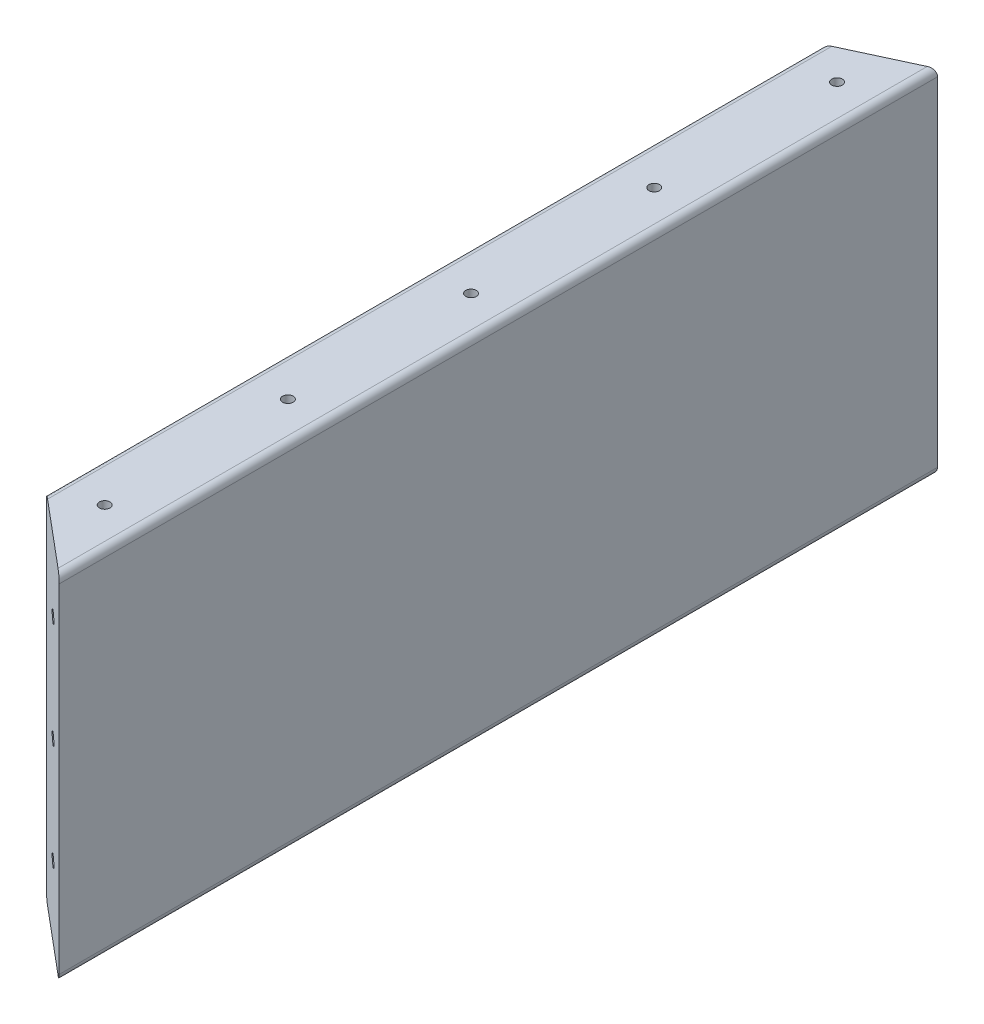
ISO-10303-21;
HEADER;
FILE_DESCRIPTION(('STEP AP214'),'2;1');
FILE_NAME('part.step','',(''),(''),'','','');
FILE_SCHEMA(('AUTOMOTIVE_DESIGN { 1 0 10303 214 1 1 1 1 }'));
ENDSEC;
DATA;
#1=APPLICATION_CONTEXT('core data for automotive mechanical design processes');
#2=APPLICATION_PROTOCOL_DEFINITION('international standard','automotive_design',2000,#1);
#3=PRODUCT_CONTEXT('',#1,'mechanical');
#4=PRODUCT('Part','Part','',(#3));
#5=PRODUCT_RELATED_PRODUCT_CATEGORY('part','',(#4));
#6=PRODUCT_DEFINITION_FORMATION('','',#4);
#7=PRODUCT_DEFINITION_CONTEXT('part definition',#1,'design');
#8=PRODUCT_DEFINITION('design','',#6,#7);
#9=PRODUCT_DEFINITION_SHAPE('','',#8);
#10=(LENGTH_UNIT() NAMED_UNIT(*) SI_UNIT(.MILLI.,.METRE.));
#11=(NAMED_UNIT(*) PLANE_ANGLE_UNIT() SI_UNIT($,.RADIAN.));
#12=(NAMED_UNIT(*) SI_UNIT($,.STERADIAN.) SOLID_ANGLE_UNIT());
#13=UNCERTAINTY_MEASURE_WITH_UNIT(LENGTH_MEASURE(1.E-05),#10,'distance_accuracy_value','');
#14=(GEOMETRIC_REPRESENTATION_CONTEXT(3) GLOBAL_UNCERTAINTY_ASSIGNED_CONTEXT((#13)) GLOBAL_UNIT_ASSIGNED_CONTEXT((#10,
#11,#12)) REPRESENTATION_CONTEXT('',''));
#15=CARTESIAN_POINT('',(0.,0.,0.));
#16=DIRECTION('',(0.,0.,1.));
#17=DIRECTION('',(1.,0.,0.));
#18=AXIS2_PLACEMENT_3D('',#15,#16,#17);
#19=CARTESIAN_POINT('',(-31.1882554112285,134.272684877163,510.));
#20=DIRECTION('',(0.,-1.,0.));
#21=DIRECTION('',(0.,0.,-1.));
#22=AXIS2_PLACEMENT_3D('',#19,#20,#21);
#23=PLANE('',#22);
#24=CARTESIAN_POINT('',(-8.08623886319948,134.272684877163,450.93561149229));
#25=DIRECTION('',(0.,-1.,0.));
#26=DIRECTION('',(0.,0.,-1.));
#27=AXIS2_PLACEMENT_3D('',#24,#25,#26);
#28=CIRCLE('',#27,2.99999999999999);
#29=CARTESIAN_POINT('',(-8.08623886319948,134.272684877163,447.93561149229));
#30=VERTEX_POINT('',#29);
#31=EDGE_CURVE('E175',#30,#30,#28,.T.);
#32=ORIENTED_EDGE('',*,*,#31,.T.);
#33=EDGE_LOOP('',(#32));
#34=FACE_BOUND('',#33,.T.);
#35=CARTESIAN_POINT('',(-8.11900232171636,134.272684877163,35.1370040691587));
#36=DIRECTION('',(0.,-1.,0.));
#37=DIRECTION('',(0.,0.,-1.));
#38=AXIS2_PLACEMENT_3D('',#35,#36,#37);
#39=CIRCLE('',#38,2.99999999999999);
#40=CARTESIAN_POINT('',(-8.11900232171636,134.272684877163,32.1370040691587));
#41=VERTEX_POINT('',#40);
#42=EDGE_CURVE('E179',#41,#41,#39,.T.);
#43=ORIENTED_EDGE('',*,*,#42,.T.);
#44=EDGE_LOOP('',(#43));
#45=FACE_BOUND('',#44,.T.);
#46=CARTESIAN_POINT('',(-8.0944336950588,134.272684877163,346.935611815152));
#47=DIRECTION('',(0.,-1.,0.));
#48=DIRECTION('',(0.,0.,-1.));
#49=AXIS2_PLACEMENT_3D('',#46,#47,#48);
#50=CIRCLE('',#49,2.99999999999999);
#51=CARTESIAN_POINT('',(-8.0944336950588,134.272684877163,343.935611815152));
#52=VERTEX_POINT('',#51);
#53=EDGE_CURVE('E183',#52,#52,#50,.T.);
#54=ORIENTED_EDGE('',*,*,#53,.T.);
#55=EDGE_LOOP('',(#54));
#56=FACE_BOUND('',#55,.T.);
#57=CARTESIAN_POINT('',(-8.10262852691812,134.272684877163,242.935612138014));
#58=DIRECTION('',(0.,-1.,0.));
#59=DIRECTION('',(0.,0.,-1.));
#60=AXIS2_PLACEMENT_3D('',#57,#58,#59);
#61=CIRCLE('',#60,2.99999999999999);
#62=CARTESIAN_POINT('',(-8.10262852691812,134.272684877163,239.935612138014));
#63=VERTEX_POINT('',#62);
#64=EDGE_CURVE('E187',#63,#63,#61,.T.);
#65=ORIENTED_EDGE('',*,*,#64,.T.);
#66=EDGE_LOOP('',(#65));
#67=FACE_BOUND('',#66,.T.);
#68=CARTESIAN_POINT('',(-8.11082335877744,134.272684877163,138.935612460876));
#69=DIRECTION('',(0.,-1.,0.));
#70=DIRECTION('',(0.,0.,-1.));
#71=AXIS2_PLACEMENT_3D('',#68,#69,#70);
#72=CIRCLE('',#71,2.99999999999999);
#73=CARTESIAN_POINT('',(-8.11082335877744,134.272684877163,135.935612460876));
#74=VERTEX_POINT('',#73);
#75=EDGE_CURVE('E191',#74,#74,#72,.T.);
#76=ORIENTED_EDGE('',*,*,#75,.T.);
#77=EDGE_LOOP('',(#76));
#78=FACE_BOUND('',#77,.T.);
#79=DIRECTION('',(0.907126965711573,0.,-0.420857063715122));
#80=VECTOR('',#79,1.);
#81=CARTESIAN_POINT('',(-217.92092886283,134.272684877163,107.511226324524));
#82=LINE('',#81,#80);
#83=CARTESIAN_POINT('',(-27.1882554112285,134.272684877163,19.0217469709818));
#84=VERTEX_POINT('',#83);
#85=CARTESIAN_POINT('',(9.81174458877147,134.272684877163,1.85578019229093));
#86=VERTEX_POINT('',#85);
#87=EDGE_CURVE('E49',#84,#86,#82,.T.);
#88=ORIENTED_EDGE('',*,*,#87,.F.);
#89=DIRECTION('',(0.,0.,-1.));
#90=VECTOR('',#89,1.);
#91=CARTESIAN_POINT('',(-27.1882554112285,134.272684877163,510.));
#92=LINE('',#91,#90);
#93=CARTESIAN_POINT('',(-27.1882554112285,134.272684877163,464.274109805575));
#94=VERTEX_POINT('',#93);
#95=EDGE_CURVE('E41',#84,#94,#92,.F.);
#96=ORIENTED_EDGE('',*,*,#95,.T.);
#97=DIRECTION('',(-0.766068203582476,0.,-0.642759292005894));
#98=VECTOR('',#97,1.);
#99=CARTESIAN_POINT('',(-7.02038536886983,134.272684877163,481.195691734014));
#100=LINE('',#99,#98);
#101=CARTESIAN_POINT('',(9.81174458877147,134.272684877163,495.318465507851));
#102=VERTEX_POINT('',#101);
#103=EDGE_CURVE('E251',#102,#94,#100,.T.);
#104=ORIENTED_EDGE('',*,*,#103,.F.);
#105=DIRECTION('',(0.,0.,-1.));
#106=VECTOR('',#105,1.);
#107=CARTESIAN_POINT('',(9.81174458877147,134.272684877163,510.));
#108=LINE('',#107,#106);
#109=EDGE_CURVE('E286',#102,#86,#108,.T.);
#110=ORIENTED_EDGE('',*,*,#109,.T.);
#111=EDGE_LOOP('',(#88,#96,#104,#110));
#112=FACE_BOUND('',#111,.T.);
#113=ADVANCED_FACE('F32',(#34,#45,#56,#67,#78,#112),#23,.F.);
#114=CARTESIAN_POINT('',(-31.1882554112285,-65.7273151228369,510.));
#115=DIRECTION('',(0.,1.,0.));
#116=DIRECTION('',(0.,0.,1.));
#117=AXIS2_PLACEMENT_3D('',#114,#115,#116);
#118=PLANE('',#117);
#119=CARTESIAN_POINT('',(-8.08623886319952,-65.7273151228369,450.93561149229));
#120=DIRECTION('',(0.,1.,0.));
#121=DIRECTION('',(0.,0.,1.));
#122=AXIS2_PLACEMENT_3D('',#119,#120,#121);
#123=CIRCLE('',#122,2.99999999999999);
#124=CARTESIAN_POINT('',(-8.08623886319952,-65.7273151228369,453.93561149229));
#125=VERTEX_POINT('',#124);
#126=EDGE_CURVE('E36',#125,#125,#123,.T.);
#127=ORIENTED_EDGE('',*,*,#126,.T.);
#128=EDGE_LOOP('',(#127));
#129=FACE_BOUND('',#128,.T.);
#130=CARTESIAN_POINT('',(-8.1190023217164,-65.7273151228369,35.1370040691587));
#131=DIRECTION('',(0.,1.,0.));
#132=DIRECTION('',(0.,0.,1.));
#133=AXIS2_PLACEMENT_3D('',#130,#131,#132);
#134=CIRCLE('',#133,2.99999999999999);
#135=CARTESIAN_POINT('',(-8.1190023217164,-65.7273151228369,38.1370040691587));
#136=VERTEX_POINT('',#135);
#137=EDGE_CURVE('E159',#136,#136,#134,.T.);
#138=ORIENTED_EDGE('',*,*,#137,.T.);
#139=EDGE_LOOP('',(#138));
#140=FACE_BOUND('',#139,.T.);
#141=CARTESIAN_POINT('',(-8.09443369505884,-65.7273151228369,346.935611815152));
#142=DIRECTION('',(0.,1.,0.));
#143=DIRECTION('',(0.,0.,1.));
#144=AXIS2_PLACEMENT_3D('',#141,#142,#143);
#145=CIRCLE('',#144,2.99999999999999);
#146=CARTESIAN_POINT('',(-8.09443369505884,-65.7273151228369,349.935611815152));
#147=VERTEX_POINT('',#146);
#148=EDGE_CURVE('E163',#147,#147,#145,.T.);
#149=ORIENTED_EDGE('',*,*,#148,.T.);
#150=EDGE_LOOP('',(#149));
#151=FACE_BOUND('',#150,.T.);
#152=CARTESIAN_POINT('',(-8.10262852691816,-65.7273151228369,242.935612138014));
#153=DIRECTION('',(0.,1.,0.));
#154=DIRECTION('',(0.,0.,1.));
#155=AXIS2_PLACEMENT_3D('',#152,#153,#154);
#156=CIRCLE('',#155,2.99999999999999);
#157=CARTESIAN_POINT('',(-8.10262852691816,-65.7273151228369,245.935612138014));
#158=VERTEX_POINT('',#157);
#159=EDGE_CURVE('E167',#158,#158,#156,.T.);
#160=ORIENTED_EDGE('',*,*,#159,.T.);
#161=EDGE_LOOP('',(#160));
#162=FACE_BOUND('',#161,.T.);
#163=CARTESIAN_POINT('',(-8.11082335877748,-65.7273151228369,138.935612460876));
#164=DIRECTION('',(0.,1.,0.));
#165=DIRECTION('',(0.,0.,1.));
#166=AXIS2_PLACEMENT_3D('',#163,#164,#165);
#167=CIRCLE('',#166,2.99999999999999);
#168=CARTESIAN_POINT('',(-8.11082335877748,-65.7273151228369,141.935612460876));
#169=VERTEX_POINT('',#168);
#170=EDGE_CURVE('E171',#169,#169,#167,.T.);
#171=ORIENTED_EDGE('',*,*,#170,.T.);
#172=EDGE_LOOP('',(#171));
#173=FACE_BOUND('',#172,.T.);
#174=DIRECTION('',(-0.907126965711573,0.,0.420857063715122));
#175=VECTOR('',#174,1.);
#176=CARTESIAN_POINT('',(-217.92092886283,-65.7273151228369,107.511226324524));
#177=LINE('',#176,#175);
#178=CARTESIAN_POINT('',(9.81174458877147,-65.7273151228369,1.85578019229093));
#179=VERTEX_POINT('',#178);
#180=CARTESIAN_POINT('',(-27.1882554112285,-65.7273151228369,19.0217469709818));
#181=VERTEX_POINT('',#180);
#182=EDGE_CURVE('E243',#179,#181,#177,.T.);
#183=ORIENTED_EDGE('',*,*,#182,.F.);
#184=DIRECTION('',(0.,0.,-1.));
#185=VECTOR('',#184,1.);
#186=CARTESIAN_POINT('',(9.81174458877147,-65.7273151228369,510.));
#187=LINE('',#186,#185);
#188=CARTESIAN_POINT('',(9.81174458877147,-65.7273151228369,495.318465507851));
#189=VERTEX_POINT('',#188);
#190=EDGE_CURVE('E270',#179,#189,#187,.F.);
#191=ORIENTED_EDGE('',*,*,#190,.T.);
#192=DIRECTION('',(0.766068203582476,0.,0.642759292005894));
#193=VECTOR('',#192,1.);
#194=CARTESIAN_POINT('',(-7.02038536886982,-65.7273151228369,481.195691734014));
#195=LINE('',#194,#193);
#196=CARTESIAN_POINT('',(-27.1882554112285,-65.7273151228369,464.274109805575));
#197=VERTEX_POINT('',#196);
#198=EDGE_CURVE('E261',#197,#189,#195,.T.);
#199=ORIENTED_EDGE('',*,*,#198,.F.);
#200=DIRECTION('',(0.,0.,-1.));
#201=VECTOR('',#200,1.);
#202=CARTESIAN_POINT('',(-27.1882554112285,-65.7273151228369,510.));
#203=LINE('',#202,#201);
#204=EDGE_CURVE('E272',#197,#181,#203,.T.);
#205=ORIENTED_EDGE('',*,*,#204,.T.);
#206=EDGE_LOOP('',(#183,#191,#199,#205));
#207=FACE_BOUND('',#206,.T.);
#208=ADVANCED_FACE('F314',(#129,#140,#151,#162,#173,#207),#118,.F.);
#209=CARTESIAN_POINT('',(-27.1882554112285,-61.7273151228369,510.));
#210=DIRECTION('',(0.,0.,-1.));
#211=DIRECTION('',(-1.,0.,0.));
#212=AXIS2_PLACEMENT_3D('',#209,#210,#211);
#213=CYLINDRICAL_SURFACE('',#212,4.);
#214=DIRECTION('',(0.,0.,-1.));
#215=VECTOR('',#214,1.);
#216=CARTESIAN_POINT('',(-31.1882554112285,-61.7273151228369,510.));
#217=LINE('',#216,#215);
#218=CARTESIAN_POINT('',(-31.1882554112285,-61.7273151228369,20.8775271632726));
#219=VERTEX_POINT('',#218);
#220=CARTESIAN_POINT('',(-31.1882554112285,-61.7273151228369,460.917963243167));
#221=VERTEX_POINT('',#220);
#222=EDGE_CURVE('E278',#219,#221,#217,.F.);
#223=ORIENTED_EDGE('',*,*,#222,.F.);
#224=CARTESIAN_POINT('',(-27.1882554112285,-61.7273151228369,19.0217469709817));
#225=DIRECTION('',(-0.420857063715122,0.,-0.907126965711573));
#226=DIRECTION('',(0.907126965711573,0.,-0.420857063715122));
#227=AXIS2_PLACEMENT_3D('',#224,#225,#226);
#228=ELLIPSE('',#227,4.40952606547453,4.);
#229=EDGE_CURVE('E245',#219,#181,#228,.F.);
#230=ORIENTED_EDGE('',*,*,#229,.T.);
#231=ORIENTED_EDGE('',*,*,#204,.F.);
#232=CARTESIAN_POINT('',(-27.1882554112285,-61.7273151228369,464.274109805575));
#233=DIRECTION('',(-0.642759292005894,0.,0.766068203582476));
#234=DIRECTION('',(-0.766068203582476,0.,-0.642759292005894));
#235=AXIS2_PLACEMENT_3D('',#232,#233,#234);
#236=ELLIPSE('',#235,5.22146720265143,4.);
#237=EDGE_CURVE('E264',#197,#221,#236,.F.);
#238=ORIENTED_EDGE('',*,*,#237,.T.);
#239=EDGE_LOOP('',(#223,#230,#231,#238));
#240=FACE_BOUND('',#239,.T.);
#241=ADVANCED_FACE('F340',(#240),#213,.T.);
#242=CARTESIAN_POINT('',(9.81174458877148,-61.7273151228369,510.));
#243=DIRECTION('',(0.,0.,-1.));
#244=DIRECTION('',(-1.,0.,0.));
#245=AXIS2_PLACEMENT_3D('',#242,#243,#244);
#246=CYLINDRICAL_SURFACE('',#245,4.);
#247=ORIENTED_EDGE('',*,*,#190,.F.);
#248=CARTESIAN_POINT('',(9.81174458877148,-61.7273151228369,1.85578019229093));
#249=DIRECTION('',(-0.420857063715122,0.,-0.907126965711573));
#250=DIRECTION('',(0.907126965711573,0.,-0.420857063715122));
#251=AXIS2_PLACEMENT_3D('',#248,#249,#250);
#252=ELLIPSE('',#251,4.40952606547453,4.);
#253=CARTESIAN_POINT('',(13.8117445887715,-61.7273151228369,0.));
#254=VERTEX_POINT('',#253);
#255=EDGE_CURVE('E240',#179,#254,#252,.F.);
#256=ORIENTED_EDGE('',*,*,#255,.T.);
#257=DIRECTION('',(0.,0.,-1.));
#258=VECTOR('',#257,1.);
#259=CARTESIAN_POINT('',(13.8117445887715,-61.7273151228369,510.));
#260=LINE('',#259,#258);
#261=CARTESIAN_POINT('',(13.8117445887715,-61.7273151228369,498.674612070259));
#262=VERTEX_POINT('',#261);
#263=EDGE_CURVE('E283',#262,#254,#260,.T.);
#264=ORIENTED_EDGE('',*,*,#263,.F.);
#265=CARTESIAN_POINT('',(9.81174458877148,-61.7273151228369,495.318465507851));
#266=DIRECTION('',(-0.642759292005894,0.,0.766068203582476));
#267=DIRECTION('',(-0.766068203582476,0.,-0.642759292005894));
#268=AXIS2_PLACEMENT_3D('',#265,#266,#267);
#269=ELLIPSE('',#268,5.22146720265143,4.);
#270=EDGE_CURVE('E258',#262,#189,#269,.F.);
#271=ORIENTED_EDGE('',*,*,#270,.T.);
#272=EDGE_LOOP('',(#247,#256,#264,#271));
#273=FACE_BOUND('',#272,.T.);
#274=ADVANCED_FACE('F349',(#273),#246,.T.);
#275=CARTESIAN_POINT('',(-27.1882554112285,130.272684877163,510.));
#276=DIRECTION('',(0.,0.,-1.));
#277=DIRECTION('',(-1.,0.,0.));
#278=AXIS2_PLACEMENT_3D('',#275,#276,#277);
#279=CYLINDRICAL_SURFACE('',#278,4.);
#280=ORIENTED_EDGE('',*,*,#95,.F.);
#281=CARTESIAN_POINT('',(-27.1882554112285,130.272684877163,19.0217469709817));
#282=DIRECTION('',(-0.420857063715122,0.,-0.907126965711573));
#283=DIRECTION('',(0.907126965711573,0.,-0.420857063715122));
#284=AXIS2_PLACEMENT_3D('',#281,#282,#283);
#285=ELLIPSE('',#284,4.40952606547453,4.);
#286=CARTESIAN_POINT('',(-31.1882554112285,130.272684877163,20.8775271632726));
#287=VERTEX_POINT('',#286);
#288=EDGE_CURVE('E237',#84,#287,#285,.F.);
#289=ORIENTED_EDGE('',*,*,#288,.T.);
#290=DIRECTION('',(0.,0.,-1.));
#291=VECTOR('',#290,1.);
#292=CARTESIAN_POINT('',(-31.1882554112285,130.272684877163,510.));
#293=LINE('',#292,#291);
#294=CARTESIAN_POINT('',(-31.1882554112285,130.272684877163,460.917963243167));
#295=VERTEX_POINT('',#294);
#296=EDGE_CURVE('E275',#295,#287,#293,.T.);
#297=ORIENTED_EDGE('',*,*,#296,.F.);
#298=CARTESIAN_POINT('',(-27.1882554112285,130.272684877163,464.274109805575));
#299=DIRECTION('',(-0.642759292005894,0.,0.766068203582476));
#300=DIRECTION('',(-0.766068203582476,0.,-0.642759292005894));
#301=AXIS2_PLACEMENT_3D('',#298,#299,#300);
#302=ELLIPSE('',#301,5.22146720265143,4.);
#303=EDGE_CURVE('E255',#295,#94,#302,.F.);
#304=ORIENTED_EDGE('',*,*,#303,.T.);
#305=EDGE_LOOP('',(#280,#289,#297,#304));
#306=FACE_BOUND('',#305,.T.);
#307=ADVANCED_FACE('F352',(#306),#279,.T.);
#308=CARTESIAN_POINT('',(9.81174458877147,130.272684877163,510.));
#309=DIRECTION('',(0.,0.,-1.));
#310=DIRECTION('',(-1.,0.,0.));
#311=AXIS2_PLACEMENT_3D('',#308,#309,#310);
#312=CYLINDRICAL_SURFACE('',#311,4.);
#313=DIRECTION('',(0.,0.,-1.));
#314=VECTOR('',#313,1.);
#315=CARTESIAN_POINT('',(13.8117445887715,130.272684877163,510.));
#316=LINE('',#315,#314);
#317=CARTESIAN_POINT('',(13.8117445887715,130.272684877163,0.));
#318=VERTEX_POINT('',#317);
#319=CARTESIAN_POINT('',(13.8117445887715,130.272684877163,498.674612070259));
#320=VERTEX_POINT('',#319);
#321=EDGE_CURVE('E280',#318,#320,#316,.F.);
#322=ORIENTED_EDGE('',*,*,#321,.F.);
#323=CARTESIAN_POINT('',(9.81174458877147,130.272684877163,1.85578019229093));
#324=DIRECTION('',(-0.420857063715122,0.,-0.907126965711573));
#325=DIRECTION('',(0.907126965711573,0.,-0.420857063715122));
#326=AXIS2_PLACEMENT_3D('',#323,#324,#325);
#327=ELLIPSE('',#326,4.40952606547453,4.);
#328=EDGE_CURVE('E234',#318,#86,#327,.F.);
#329=ORIENTED_EDGE('',*,*,#328,.T.);
#330=ORIENTED_EDGE('',*,*,#109,.F.);
#331=CARTESIAN_POINT('',(9.81174458877147,130.272684877163,495.318465507851));
#332=DIRECTION('',(-0.642759292005894,0.,0.766068203582476));
#333=DIRECTION('',(-0.766068203582476,0.,-0.642759292005894));
#334=AXIS2_PLACEMENT_3D('',#331,#332,#333);
#335=ELLIPSE('',#334,5.22146720265143,4.);
#336=EDGE_CURVE('E11',#102,#320,#335,.F.);
#337=ORIENTED_EDGE('',*,*,#336,.T.);
#338=EDGE_LOOP('',(#322,#329,#330,#337));
#339=FACE_BOUND('',#338,.T.);
#340=ADVANCED_FACE('F34',(#339),#312,.T.);
#341=CARTESIAN_POINT('',(-31.1882554112285,134.272684877163,510.));
#342=DIRECTION('',(1.,0.,0.));
#343=DIRECTION('',(0.,1.,0.));
#344=AXIS2_PLACEMENT_3D('',#341,#342,#343);
#345=PLANE('',#344);
#346=ORIENTED_EDGE('',*,*,#296,.T.);
#347=DIRECTION('',(0.,-1.,0.));
#348=VECTOR('',#347,1.);
#349=CARTESIAN_POINT('',(-31.1882554112285,813.231799831734,20.8775271632727));
#350=LINE('',#349,#348);
#351=EDGE_CURVE('E231',#287,#219,#350,.T.);
#352=ORIENTED_EDGE('',*,*,#351,.T.);
#353=ORIENTED_EDGE('',*,*,#222,.T.);
#354=DIRECTION('',(0.,-1.,0.));
#355=VECTOR('',#354,1.);
#356=CARTESIAN_POINT('',(-31.1882554112285,821.346416364549,460.917963243167));
#357=LINE('',#356,#355);
#358=EDGE_CURVE('E248',#295,#221,#357,.T.);
#359=ORIENTED_EDGE('',*,*,#358,.F.);
#360=EDGE_LOOP('',(#346,#352,#353,#359));
#361=FACE_BOUND('',#360,.T.);
#362=ADVANCED_FACE('F346',(#361),#345,.F.);
#363=CARTESIAN_POINT('',(13.8117445887715,134.272684877163,510.));
#364=DIRECTION('',(-1.,0.,0.));
#365=DIRECTION('',(0.,0.,1.));
#366=AXIS2_PLACEMENT_3D('',#363,#364,#365);
#367=PLANE('',#366);
#368=ORIENTED_EDGE('',*,*,#321,.T.);
#369=DIRECTION('',(0.,-1.,0.));
#370=VECTOR('',#369,1.);
#371=CARTESIAN_POINT('',(13.8117445887715,821.346416364549,498.674612070259));
#372=LINE('',#371,#370);
#373=EDGE_CURVE('E57',#320,#262,#372,.T.);
#374=ORIENTED_EDGE('',*,*,#373,.T.);
#375=ORIENTED_EDGE('',*,*,#263,.T.);
#376=DIRECTION('',(0.,1.,0.));
#377=VECTOR('',#376,1.);
#378=CARTESIAN_POINT('',(13.8117445887715,134.272684877163,0.));
#379=LINE('',#378,#377);
#380=EDGE_CURVE('E267',#254,#318,#379,.T.);
#381=ORIENTED_EDGE('',*,*,#380,.T.);
#382=EDGE_LOOP('',(#368,#374,#375,#381));
#383=FACE_BOUND('',#382,.T.);
#384=ADVANCED_FACE('F369',(#383),#367,.F.);
#385=CARTESIAN_POINT('',(13.8117445887715,821.346416364549,498.674612070259));
#386=DIRECTION('',(-0.642759292005894,0.,0.766068203582476));
#387=DIRECTION('',(0.766068203582476,0.,0.642759292005894));
#388=AXIS2_PLACEMENT_3D('',#385,#386,#387);
#389=PLANE('',#388);
#390=CARTESIAN_POINT('',(-7.918215451858,94.2726848771541,480.442379397352));
#391=DIRECTION('',(-0.642759292005894,0.,0.766068203582476));
#392=DIRECTION('',(0.766068203582476,0.,0.642759292005894));
#393=AXIS2_PLACEMENT_3D('',#390,#391,#392);
#394=ELLIPSE('',#393,3.91610040198854,2.99999999999998);
#395=CARTESIAN_POINT('',(-4.91821545185802,94.2726848771541,482.959489319159));
#396=VERTEX_POINT('',#395);
#397=EDGE_CURVE('E195',#396,#396,#394,.T.);
#398=ORIENTED_EDGE('',*,*,#397,.F.);
#399=EDGE_LOOP('',(#398));
#400=FACE_BOUND('',#399,.T.);
#401=CARTESIAN_POINT('',(-7.918215451858,34.2726848771547,480.442379397352));
#402=DIRECTION('',(-0.642759292005894,0.,0.766068203582476));
#403=DIRECTION('',(0.766068203582476,0.,0.642759292005894));
#404=AXIS2_PLACEMENT_3D('',#401,#402,#403);
#405=ELLIPSE('',#404,3.91610040198854,2.99999999999998);
#406=CARTESIAN_POINT('',(-4.91821545185802,34.2726848771547,482.959489319159));
#407=VERTEX_POINT('',#406);
#408=EDGE_CURVE('E199',#407,#407,#405,.T.);
#409=ORIENTED_EDGE('',*,*,#408,.F.);
#410=EDGE_LOOP('',(#409));
#411=FACE_BOUND('',#410,.T.);
#412=CARTESIAN_POINT('',(-7.918215451858,-25.7273151228453,480.442379397352));
#413=DIRECTION('',(-0.642759292005894,0.,0.766068203582476));
#414=DIRECTION('',(0.766068203582476,0.,0.642759292005894));
#415=AXIS2_PLACEMENT_3D('',#412,#413,#414);
#416=ELLIPSE('',#415,3.91610040198854,2.99999999999998);
#417=CARTESIAN_POINT('',(-4.91821545185802,-25.7273151228453,482.959489319159));
#418=VERTEX_POINT('',#417);
#419=EDGE_CURVE('E203',#418,#418,#416,.T.);
#420=ORIENTED_EDGE('',*,*,#419,.F.);
#421=EDGE_LOOP('',(#420));
#422=FACE_BOUND('',#421,.T.);
#423=ORIENTED_EDGE('',*,*,#237,.F.);
#424=ORIENTED_EDGE('',*,*,#198,.T.);
#425=ORIENTED_EDGE('',*,*,#270,.F.);
#426=ORIENTED_EDGE('',*,*,#373,.F.);
#427=ORIENTED_EDGE('',*,*,#336,.F.);
#428=ORIENTED_EDGE('',*,*,#103,.T.);
#429=ORIENTED_EDGE('',*,*,#303,.F.);
#430=ORIENTED_EDGE('',*,*,#358,.T.);
#431=EDGE_LOOP('',(#423,#424,#425,#426,#427,#428,#429,#430));
#432=FACE_BOUND('',#431,.T.);
#433=ADVANCED_FACE('F365',(#400,#411,#422,#432),#389,.T.);
#434=CARTESIAN_POINT('',(-31.1882554112285,813.231799831734,20.8775271632727));
#435=DIRECTION('',(-0.420857063715122,0.,-0.907126965711573));
#436=DIRECTION('',(-0.907126965711573,0.,0.420857063715122));
#437=AXIS2_PLACEMENT_3D('',#434,#435,#436);
#438=PLANE('',#437);
#439=CARTESIAN_POINT('',(-10.7778986827183,-25.7273151228369,11.4082432296824));
#440=DIRECTION('',(-0.420857063715122,0.,-0.907126965711573));
#441=DIRECTION('',(-0.907126965711573,0.,0.420857063715122));
#442=AXIS2_PLACEMENT_3D('',#439,#440,#441);
#443=CIRCLE('',#442,4.025);
#444=CARTESIAN_POINT('',(-14.4290847197074,-25.7273151228369,13.1021929111357));
#445=VERTEX_POINT('',#444);
#446=EDGE_CURVE('E204',#445,#445,#443,.T.);
#447=ORIENTED_EDGE('',*,*,#446,.F.);
#448=EDGE_LOOP('',(#447));
#449=FACE_BOUND('',#448,.T.);
#450=CARTESIAN_POINT('',(-10.7778986827183,34.2726848771631,11.4082432296824));
#451=DIRECTION('',(-0.420857063715122,0.,-0.907126965711573));
#452=DIRECTION('',(-0.907126965711573,0.,0.420857063715122));
#453=AXIS2_PLACEMENT_3D('',#450,#451,#452);
#454=CIRCLE('',#453,4.025);
#455=CARTESIAN_POINT('',(-14.4290847197074,34.2726848771631,13.1021929111357));
#456=VERTEX_POINT('',#455);
#457=EDGE_CURVE('E213',#456,#456,#454,.T.);
#458=ORIENTED_EDGE('',*,*,#457,.F.);
#459=EDGE_LOOP('',(#458));
#460=FACE_BOUND('',#459,.T.);
#461=CARTESIAN_POINT('',(-10.7778986827183,94.2726848771631,11.4082432296824));
#462=DIRECTION('',(-0.420857063715122,0.,-0.907126965711573));
#463=DIRECTION('',(-0.907126965711573,0.,0.420857063715122));
#464=AXIS2_PLACEMENT_3D('',#461,#462,#463);
#465=CIRCLE('',#464,4.025);
#466=CARTESIAN_POINT('',(-14.4290847197074,94.2726848771631,13.1021929111357));
#467=VERTEX_POINT('',#466);
#468=EDGE_CURVE('E222',#467,#467,#465,.T.);
#469=ORIENTED_EDGE('',*,*,#468,.F.);
#470=EDGE_LOOP('',(#469));
#471=FACE_BOUND('',#470,.T.);
#472=ORIENTED_EDGE('',*,*,#229,.F.);
#473=ORIENTED_EDGE('',*,*,#351,.F.);
#474=ORIENTED_EDGE('',*,*,#288,.F.);
#475=ORIENTED_EDGE('',*,*,#87,.T.);
#476=ORIENTED_EDGE('',*,*,#328,.F.);
#477=ORIENTED_EDGE('',*,*,#380,.F.);
#478=ORIENTED_EDGE('',*,*,#255,.F.);
#479=ORIENTED_EDGE('',*,*,#182,.T.);
#480=EDGE_LOOP('',(#472,#473,#474,#475,#476,#477,#478,#479));
#481=FACE_BOUND('',#480,.T.);
#482=ADVANCED_FACE('F371',(#449,#460,#471,#481),#438,.T.);
#483=CARTESIAN_POINT('',(-1.26797783314418,94.2726848771631,31.9061898918555));
#484=DIRECTION('',(-0.420857063715122,0.,-0.907126965711573));
#485=DIRECTION('',(-0.907126965711573,0.,0.420857063715122));
#486=AXIS2_PLACEMENT_3D('',#483,#484,#485);
#487=CONICAL_SURFACE('',#486,3.99999999999999,1.02974425867665);
#488=CARTESIAN_POINT('',(-0.256472089840226,94.2726848771631,34.0864173724717));
#489=VERTEX_POINT('',#488);
#490=VERTEX_LOOP('',#489);
#491=FACE_BOUND('',#490,.T.);
#492=CARTESIAN_POINT('',(-1.26797783314418,94.2726848771631,31.9061898918555));
#493=DIRECTION('',(-0.420857063715122,0.,-0.907126965711573));
#494=DIRECTION('',(-0.907126965711573,0.,0.420857063715122));
#495=AXIS2_PLACEMENT_3D('',#492,#493,#494);
#496=CIRCLE('',#495,3.99999999999999);
#497=CARTESIAN_POINT('',(-4.89648569599047,94.2726848771631,33.589618146716));
#498=VERTEX_POINT('',#497);
#499=EDGE_CURVE('E228',#498,#498,#496,.T.);
#500=ORIENTED_EDGE('',*,*,#499,.T.);
#501=EDGE_LOOP('',(#500));
#502=FACE_BOUND('',#501,.T.);
#503=ADVANCED_FACE('F392',(#491,#502),#487,.F.);
#504=CARTESIAN_POINT('',(-10.7778986827183,94.2726848771631,11.4082432296824));
#505=DIRECTION('',(-0.420857063715122,0.,-0.907126965711573));
#506=DIRECTION('',(-0.907126965711573,0.,0.420857063715122));
#507=AXIS2_PLACEMENT_3D('',#504,#505,#506);
#508=CYLINDRICAL_SURFACE('',#507,3.99999999999999);
#509=ORIENTED_EDGE('',*,*,#499,.F.);
#510=EDGE_LOOP('',(#509));
#511=FACE_BOUND('',#510,.T.);
#512=CARTESIAN_POINT('',(-10.7673772561254,94.2726848771631,11.4309214038252));
#513=DIRECTION('',(-0.420857063715122,0.,-0.907126965711573));
#514=DIRECTION('',(-0.907126965711573,0.,0.420857063715122));
#515=AXIS2_PLACEMENT_3D('',#512,#513,#514);
#516=CIRCLE('',#515,3.99999999999999);
#517=CARTESIAN_POINT('',(-14.3958851189717,94.2726848771631,13.1143496586857));
#518=VERTEX_POINT('',#517);
#519=EDGE_CURVE('E225',#518,#518,#516,.T.);
#520=ORIENTED_EDGE('',*,*,#519,.T.);
#521=EDGE_LOOP('',(#520));
#522=FACE_BOUND('',#521,.T.);
#523=ADVANCED_FACE('F396',(#511,#522),#508,.F.);
#524=CARTESIAN_POINT('',(-10.7778986827183,94.2726848771631,11.4082432296824));
#525=DIRECTION('',(-0.420857063715122,0.,-0.907126965711573));
#526=DIRECTION('',(-0.907126965711573,0.,0.420857063715122));
#527=AXIS2_PLACEMENT_3D('',#524,#525,#526);
#528=CONICAL_SURFACE('',#527,4.025,0.785398163397429);
#529=ORIENTED_EDGE('',*,*,#519,.F.);
#530=EDGE_LOOP('',(#529));
#531=FACE_BOUND('',#530,.T.);
#532=ORIENTED_EDGE('',*,*,#468,.T.);
#533=EDGE_LOOP('',(#532));
#534=FACE_BOUND('',#533,.T.);
#535=ADVANCED_FACE('F400',(#531,#534),#528,.F.);
#536=CARTESIAN_POINT('',(-1.26797783314418,34.2726848771631,31.9061898918555));
#537=DIRECTION('',(-0.420857063715122,0.,-0.907126965711573));
#538=DIRECTION('',(-0.907126965711573,0.,0.420857063715122));
#539=AXIS2_PLACEMENT_3D('',#536,#537,#538);
#540=CONICAL_SURFACE('',#539,4.,1.02974425867665);
#541=CARTESIAN_POINT('',(-0.256472089840226,34.2726848771631,34.0864173724717));
#542=VERTEX_POINT('',#541);
#543=VERTEX_LOOP('',#542);
#544=FACE_BOUND('',#543,.T.);
#545=CARTESIAN_POINT('',(-1.26797783314418,34.2726848771631,31.9061898918555));
#546=DIRECTION('',(-0.420857063715122,0.,-0.907126965711573));
#547=DIRECTION('',(-0.907126965711573,0.,0.420857063715122));
#548=AXIS2_PLACEMENT_3D('',#545,#546,#547);
#549=CIRCLE('',#548,4.);
#550=CARTESIAN_POINT('',(-4.89648569599047,34.2726848771631,33.589618146716));
#551=VERTEX_POINT('',#550);
#552=EDGE_CURVE('E219',#551,#551,#549,.T.);
#553=ORIENTED_EDGE('',*,*,#552,.T.);
#554=EDGE_LOOP('',(#553));
#555=FACE_BOUND('',#554,.T.);
#556=ADVANCED_FACE('F404',(#544,#555),#540,.F.);
#557=CARTESIAN_POINT('',(-10.7778986827183,34.2726848771631,11.4082432296824));
#558=DIRECTION('',(-0.420857063715122,0.,-0.907126965711573));
#559=DIRECTION('',(-0.907126965711573,0.,0.420857063715122));
#560=AXIS2_PLACEMENT_3D('',#557,#558,#559);
#561=CYLINDRICAL_SURFACE('',#560,3.99999999999999);
#562=ORIENTED_EDGE('',*,*,#552,.F.);
#563=EDGE_LOOP('',(#562));
#564=FACE_BOUND('',#563,.T.);
#565=CARTESIAN_POINT('',(-10.7673772561254,34.2726848771631,11.4309214038252));
#566=DIRECTION('',(-0.420857063715122,0.,-0.907126965711573));
#567=DIRECTION('',(-0.907126965711573,0.,0.420857063715122));
#568=AXIS2_PLACEMENT_3D('',#565,#566,#567);
#569=CIRCLE('',#568,3.99999999999999);
#570=CARTESIAN_POINT('',(-14.3958851189717,34.2726848771631,13.1143496586857));
#571=VERTEX_POINT('',#570);
#572=EDGE_CURVE('E216',#571,#571,#569,.T.);
#573=ORIENTED_EDGE('',*,*,#572,.T.);
#574=EDGE_LOOP('',(#573));
#575=FACE_BOUND('',#574,.T.);
#576=ADVANCED_FACE('F408',(#564,#575),#561,.F.);
#577=CARTESIAN_POINT('',(-10.7778986827183,34.2726848771631,11.4082432296824));
#578=DIRECTION('',(-0.420857063715122,0.,-0.907126965711573));
#579=DIRECTION('',(-0.907126965711573,0.,0.420857063715122));
#580=AXIS2_PLACEMENT_3D('',#577,#578,#579);
#581=CONICAL_SURFACE('',#580,4.025,0.785398163397429);
#582=ORIENTED_EDGE('',*,*,#572,.F.);
#583=EDGE_LOOP('',(#582));
#584=FACE_BOUND('',#583,.T.);
#585=ORIENTED_EDGE('',*,*,#457,.T.);
#586=EDGE_LOOP('',(#585));
#587=FACE_BOUND('',#586,.T.);
#588=ADVANCED_FACE('F412',(#584,#587),#581,.F.);
#589=CARTESIAN_POINT('',(-1.26797783314418,-25.7273151228369,31.9061898918555));
#590=DIRECTION('',(-0.420857063715122,0.,-0.907126965711573));
#591=DIRECTION('',(-0.907126965711573,0.,0.420857063715122));
#592=AXIS2_PLACEMENT_3D('',#589,#590,#591);
#593=CONICAL_SURFACE('',#592,3.99999999999999,1.02974425867665);
#594=CARTESIAN_POINT('',(-0.256472089840226,-25.7273151228369,34.0864173724717));
#595=VERTEX_POINT('',#594);
#596=VERTEX_LOOP('',#595);
#597=FACE_BOUND('',#596,.T.);
#598=CARTESIAN_POINT('',(-1.26797783314418,-25.7273151228369,31.9061898918555));
#599=DIRECTION('',(-0.420857063715122,0.,-0.907126965711573));
#600=DIRECTION('',(-0.907126965711573,0.,0.420857063715122));
#601=AXIS2_PLACEMENT_3D('',#598,#599,#600);
#602=CIRCLE('',#601,3.99999999999999);
#603=CARTESIAN_POINT('',(-4.89648569599047,-25.7273151228369,33.589618146716));
#604=VERTEX_POINT('',#603);
#605=EDGE_CURVE('E210',#604,#604,#602,.T.);
#606=ORIENTED_EDGE('',*,*,#605,.T.);
#607=EDGE_LOOP('',(#606));
#608=FACE_BOUND('',#607,.T.);
#609=ADVANCED_FACE('F416',(#597,#608),#593,.F.);
#610=CARTESIAN_POINT('',(-10.7778986827183,-25.7273151228369,11.4082432296824));
#611=DIRECTION('',(-0.420857063715122,0.,-0.907126965711573));
#612=DIRECTION('',(-0.907126965711573,0.,0.420857063715122));
#613=AXIS2_PLACEMENT_3D('',#610,#611,#612);
#614=CYLINDRICAL_SURFACE('',#613,3.99999999999999);
#615=ORIENTED_EDGE('',*,*,#605,.F.);
#616=EDGE_LOOP('',(#615));
#617=FACE_BOUND('',#616,.T.);
#618=CARTESIAN_POINT('',(-10.7673772561254,-25.7273151228369,11.4309214038252));
#619=DIRECTION('',(-0.420857063715122,0.,-0.907126965711573));
#620=DIRECTION('',(-0.907126965711573,0.,0.420857063715122));
#621=AXIS2_PLACEMENT_3D('',#618,#619,#620);
#622=CIRCLE('',#621,3.99999999999999);
#623=CARTESIAN_POINT('',(-14.3958851189717,-25.7273151228369,13.1143496586857));
#624=VERTEX_POINT('',#623);
#625=EDGE_CURVE('E207',#624,#624,#622,.T.);
#626=ORIENTED_EDGE('',*,*,#625,.T.);
#627=EDGE_LOOP('',(#626));
#628=FACE_BOUND('',#627,.T.);
#629=ADVANCED_FACE('F420',(#617,#628),#614,.F.);
#630=CARTESIAN_POINT('',(-10.7778986827183,-25.7273151228369,11.4082432296824));
#631=DIRECTION('',(-0.420857063715122,0.,-0.907126965711573));
#632=DIRECTION('',(-0.907126965711573,0.,0.420857063715122));
#633=AXIS2_PLACEMENT_3D('',#630,#631,#632);
#634=CONICAL_SURFACE('',#633,4.025,0.785398163397429);
#635=ORIENTED_EDGE('',*,*,#625,.F.);
#636=EDGE_LOOP('',(#635));
#637=FACE_BOUND('',#636,.T.);
#638=ORIENTED_EDGE('',*,*,#446,.T.);
#639=EDGE_LOOP('',(#638));
#640=FACE_BOUND('',#639,.T.);
#641=ADVANCED_FACE('F424',(#637,#640),#634,.F.);
#642=CARTESIAN_POINT('',(-7.918215451858,-25.7273151228453,438.26600215934));
#643=DIRECTION('',(0.,0.,1.));
#644=DIRECTION('',(1.,0.,0.));
#645=AXIS2_PLACEMENT_3D('',#642,#643,#644);
#646=CONICAL_SURFACE('',#645,2.99999999999997,1.02974425867664);
#647=CARTESIAN_POINT('',(-7.91821545185803,-25.7273151228453,436.463420302257));
#648=VERTEX_POINT('',#647);
#649=VERTEX_LOOP('',#648);
#650=FACE_BOUND('',#649,.T.);
#651=CARTESIAN_POINT('',(-7.918215451858,-25.7273151228453,438.26600215934));
#652=DIRECTION('',(0.,0.,1.));
#653=DIRECTION('',(1.,0.,0.));
#654=AXIS2_PLACEMENT_3D('',#651,#652,#653);
#655=CIRCLE('',#654,2.99999999999997);
#656=CARTESIAN_POINT('',(-4.91821545185803,-25.7273151228453,438.26600215934));
#657=VERTEX_POINT('',#656);
#658=EDGE_CURVE('E200',#657,#657,#655,.T.);
#659=ORIENTED_EDGE('',*,*,#658,.T.);
#660=EDGE_LOOP('',(#659));
#661=FACE_BOUND('',#660,.T.);
#662=ADVANCED_FACE('F428',(#650,#661),#646,.F.);
#663=CARTESIAN_POINT('',(-7.918215451858,-25.7273151228453,566.463420302257));
#664=DIRECTION('',(0.,0.,1.));
#665=DIRECTION('',(1.,0.,0.));
#666=AXIS2_PLACEMENT_3D('',#663,#664,#665);
#667=CYLINDRICAL_SURFACE('',#666,2.99999999999998);
#668=ORIENTED_EDGE('',*,*,#419,.T.);
#669=EDGE_LOOP('',(#668));
#670=FACE_BOUND('',#669,.T.);
#671=ORIENTED_EDGE('',*,*,#658,.F.);
#672=EDGE_LOOP('',(#671));
#673=FACE_BOUND('',#672,.T.);
#674=ADVANCED_FACE('F432',(#670,#673),#667,.F.);
#675=CARTESIAN_POINT('',(-7.918215451858,34.2726848771547,438.26600215934));
#676=DIRECTION('',(0.,0.,1.));
#677=DIRECTION('',(1.,0.,0.));
#678=AXIS2_PLACEMENT_3D('',#675,#676,#677);
#679=CONICAL_SURFACE('',#678,2.99999999999997,1.02974425867664);
#680=CARTESIAN_POINT('',(-7.91821545185803,34.2726848771547,436.463420302257));
#681=VERTEX_POINT('',#680);
#682=VERTEX_LOOP('',#681);
#683=FACE_BOUND('',#682,.T.);
#684=CARTESIAN_POINT('',(-7.918215451858,34.2726848771547,438.26600215934));
#685=DIRECTION('',(0.,0.,1.));
#686=DIRECTION('',(1.,0.,0.));
#687=AXIS2_PLACEMENT_3D('',#684,#685,#686);
#688=CIRCLE('',#687,2.99999999999997);
#689=CARTESIAN_POINT('',(-4.91821545185803,34.2726848771547,438.26600215934));
#690=VERTEX_POINT('',#689);
#691=EDGE_CURVE('E196',#690,#690,#688,.T.);
#692=ORIENTED_EDGE('',*,*,#691,.T.);
#693=EDGE_LOOP('',(#692));
#694=FACE_BOUND('',#693,.T.);
#695=ADVANCED_FACE('F436',(#683,#694),#679,.F.);
#696=CARTESIAN_POINT('',(-7.918215451858,34.2726848771547,566.463420302257));
#697=DIRECTION('',(0.,0.,1.));
#698=DIRECTION('',(1.,0.,0.));
#699=AXIS2_PLACEMENT_3D('',#696,#697,#698);
#700=CYLINDRICAL_SURFACE('',#699,2.99999999999998);
#701=ORIENTED_EDGE('',*,*,#408,.T.);
#702=EDGE_LOOP('',(#701));
#703=FACE_BOUND('',#702,.T.);
#704=ORIENTED_EDGE('',*,*,#691,.F.);
#705=EDGE_LOOP('',(#704));
#706=FACE_BOUND('',#705,.T.);
#707=ADVANCED_FACE('F440',(#703,#706),#700,.F.);
#708=CARTESIAN_POINT('',(-7.918215451858,94.2726848771541,438.26600215934));
#709=DIRECTION('',(0.,0.,1.));
#710=DIRECTION('',(1.,0.,0.));
#711=AXIS2_PLACEMENT_3D('',#708,#709,#710);
#712=CONICAL_SURFACE('',#711,2.99999999999997,1.02974425867664);
#713=CARTESIAN_POINT('',(-7.91821545185803,94.2726848771541,436.463420302257));
#714=VERTEX_POINT('',#713);
#715=VERTEX_LOOP('',#714);
#716=FACE_BOUND('',#715,.T.);
#717=CARTESIAN_POINT('',(-7.918215451858,94.2726848771541,438.26600215934));
#718=DIRECTION('',(0.,0.,1.));
#719=DIRECTION('',(1.,0.,0.));
#720=AXIS2_PLACEMENT_3D('',#717,#718,#719);
#721=CIRCLE('',#720,2.99999999999997);
#722=CARTESIAN_POINT('',(-4.91821545185803,94.2726848771541,438.26600215934));
#723=VERTEX_POINT('',#722);
#724=EDGE_CURVE('E192',#723,#723,#721,.T.);
#725=ORIENTED_EDGE('',*,*,#724,.T.);
#726=EDGE_LOOP('',(#725));
#727=FACE_BOUND('',#726,.T.);
#728=ADVANCED_FACE('F444',(#716,#727),#712,.F.);
#729=CARTESIAN_POINT('',(-7.918215451858,94.2726848771541,566.463420302257));
#730=DIRECTION('',(0.,0.,1.));
#731=DIRECTION('',(1.,0.,0.));
#732=AXIS2_PLACEMENT_3D('',#729,#730,#731);
#733=CYLINDRICAL_SURFACE('',#732,2.99999999999998);
#734=ORIENTED_EDGE('',*,*,#397,.T.);
#735=EDGE_LOOP('',(#734));
#736=FACE_BOUND('',#735,.T.);
#737=ORIENTED_EDGE('',*,*,#724,.F.);
#738=EDGE_LOOP('',(#737));
#739=FACE_BOUND('',#738,.T.);
#740=ADVANCED_FACE('F448',(#736,#739),#733,.F.);
#741=CARTESIAN_POINT('',(-8.11082335877744,146.272684877158,138.935612460876));
#742=DIRECTION('',(0.,1.,0.));
#743=DIRECTION('',(0.,0.,1.));
#744=AXIS2_PLACEMENT_3D('',#741,#742,#743);
#745=CYLINDRICAL_SURFACE('',#744,2.99999999999999);
#746=CARTESIAN_POINT('',(-8.11082335877744,118.07526673424,138.935612460876));
#747=DIRECTION('',(0.,1.,0.));
#748=DIRECTION('',(0.,0.,1.));
#749=AXIS2_PLACEMENT_3D('',#746,#747,#748);
#750=CIRCLE('',#749,2.99999999999999);
#751=CARTESIAN_POINT('',(-8.11082335877744,118.07526673424,141.935612460876));
#752=VERTEX_POINT('',#751);
#753=EDGE_CURVE('E188',#752,#752,#750,.T.);
#754=ORIENTED_EDGE('',*,*,#753,.F.);
#755=EDGE_LOOP('',(#754));
#756=FACE_BOUND('',#755,.T.);
#757=ORIENTED_EDGE('',*,*,#75,.F.);
#758=EDGE_LOOP('',(#757));
#759=FACE_BOUND('',#758,.T.);
#760=ADVANCED_FACE('F452',(#756,#759),#745,.F.);
#761=CARTESIAN_POINT('',(-8.11082335877744,118.07526673424,138.935612460876));
#762=DIRECTION('',(0.,1.,0.));
#763=DIRECTION('',(0.,0.,1.));
#764=AXIS2_PLACEMENT_3D('',#761,#762,#763);
#765=CONICAL_SURFACE('',#764,2.99999999999999,1.02974425867665);
#766=CARTESIAN_POINT('',(-8.11082335877745,116.272684877158,138.935612460876));
#767=VERTEX_POINT('',#766);
#768=VERTEX_LOOP('',#767);
#769=FACE_BOUND('',#768,.T.);
#770=ORIENTED_EDGE('',*,*,#753,.T.);
#771=EDGE_LOOP('',(#770));
#772=FACE_BOUND('',#771,.T.);
#773=ADVANCED_FACE('F454',(#769,#772),#765,.F.);
#774=CARTESIAN_POINT('',(-8.10262852691812,146.272684877158,242.935612138014));
#775=DIRECTION('',(0.,1.,0.));
#776=DIRECTION('',(0.,0.,1.));
#777=AXIS2_PLACEMENT_3D('',#774,#775,#776);
#778=CYLINDRICAL_SURFACE('',#777,2.99999999999999);
#779=CARTESIAN_POINT('',(-8.10262852691812,118.07526673424,242.935612138014));
#780=DIRECTION('',(0.,1.,0.));
#781=DIRECTION('',(0.,0.,1.));
#782=AXIS2_PLACEMENT_3D('',#779,#780,#781);
#783=CIRCLE('',#782,2.99999999999999);
#784=CARTESIAN_POINT('',(-8.10262852691812,118.07526673424,245.935612138014));
#785=VERTEX_POINT('',#784);
#786=EDGE_CURVE('E184',#785,#785,#783,.T.);
#787=ORIENTED_EDGE('',*,*,#786,.F.);
#788=EDGE_LOOP('',(#787));
#789=FACE_BOUND('',#788,.T.);
#790=ORIENTED_EDGE('',*,*,#64,.F.);
#791=EDGE_LOOP('',(#790));
#792=FACE_BOUND('',#791,.T.);
#793=ADVANCED_FACE('F457',(#789,#792),#778,.F.);
#794=CARTESIAN_POINT('',(-8.10262852691812,118.07526673424,242.935612138014));
#795=DIRECTION('',(0.,1.,0.));
#796=DIRECTION('',(0.,0.,1.));
#797=AXIS2_PLACEMENT_3D('',#794,#795,#796);
#798=CONICAL_SURFACE('',#797,2.99999999999999,1.02974425867665);
#799=CARTESIAN_POINT('',(-8.10262852691813,116.272684877158,242.935612138014));
#800=VERTEX_POINT('',#799);
#801=VERTEX_LOOP('',#800);
#802=FACE_BOUND('',#801,.T.);
#803=ORIENTED_EDGE('',*,*,#786,.T.);
#804=EDGE_LOOP('',(#803));
#805=FACE_BOUND('',#804,.T.);
#806=ADVANCED_FACE('F462',(#802,#805),#798,.F.);
#807=CARTESIAN_POINT('',(-8.0944336950588,146.272684877157,346.935611815152));
#808=DIRECTION('',(0.,1.,0.));
#809=DIRECTION('',(0.,0.,1.));
#810=AXIS2_PLACEMENT_3D('',#807,#808,#809);
#811=CYLINDRICAL_SURFACE('',#810,2.99999999999999);
#812=CARTESIAN_POINT('',(-8.0944336950588,118.07526673424,346.935611815152));
#813=DIRECTION('',(0.,1.,0.));
#814=DIRECTION('',(0.,0.,1.));
#815=AXIS2_PLACEMENT_3D('',#812,#813,#814);
#816=CIRCLE('',#815,2.99999999999999);
#817=CARTESIAN_POINT('',(-8.0944336950588,118.07526673424,349.935611815152));
#818=VERTEX_POINT('',#817);
#819=EDGE_CURVE('E180',#818,#818,#816,.T.);
#820=ORIENTED_EDGE('',*,*,#819,.F.);
#821=EDGE_LOOP('',(#820));
#822=FACE_BOUND('',#821,.T.);
#823=ORIENTED_EDGE('',*,*,#53,.F.);
#824=EDGE_LOOP('',(#823));
#825=FACE_BOUND('',#824,.T.);
#826=ADVANCED_FACE('F465',(#822,#825),#811,.F.);
#827=CARTESIAN_POINT('',(-8.0944336950588,118.07526673424,346.935611815152));
#828=DIRECTION('',(0.,1.,0.));
#829=DIRECTION('',(0.,0.,1.));
#830=AXIS2_PLACEMENT_3D('',#827,#828,#829);
#831=CONICAL_SURFACE('',#830,2.99999999999999,1.02974425867665);
#832=CARTESIAN_POINT('',(-8.09443369505881,116.272684877157,346.935611815152));
#833=VERTEX_POINT('',#832);
#834=VERTEX_LOOP('',#833);
#835=FACE_BOUND('',#834,.T.);
#836=ORIENTED_EDGE('',*,*,#819,.T.);
#837=EDGE_LOOP('',(#836));
#838=FACE_BOUND('',#837,.T.);
#839=ADVANCED_FACE('F470',(#835,#838),#831,.F.);
#840=CARTESIAN_POINT('',(-8.11900232171636,146.272684877158,35.1370040691587));
#841=DIRECTION('',(0.,1.,0.));
#842=DIRECTION('',(0.,0.,1.));
#843=AXIS2_PLACEMENT_3D('',#840,#841,#842);
#844=CYLINDRICAL_SURFACE('',#843,2.99999999999999);
#845=CARTESIAN_POINT('',(-8.11900232171636,118.075266734241,35.1370040691586));
#846=DIRECTION('',(0.,1.,0.));
#847=DIRECTION('',(0.,0.,1.));
#848=AXIS2_PLACEMENT_3D('',#845,#846,#847);
#849=CIRCLE('',#848,2.99999999999999);
#850=CARTESIAN_POINT('',(-8.11900232171636,118.075266734241,38.1370040691586));
#851=VERTEX_POINT('',#850);
#852=EDGE_CURVE('E176',#851,#851,#849,.T.);
#853=ORIENTED_EDGE('',*,*,#852,.F.);
#854=EDGE_LOOP('',(#853));
#855=FACE_BOUND('',#854,.T.);
#856=ORIENTED_EDGE('',*,*,#42,.F.);
#857=EDGE_LOOP('',(#856));
#858=FACE_BOUND('',#857,.T.);
#859=ADVANCED_FACE('F473',(#855,#858),#844,.F.);
#860=CARTESIAN_POINT('',(-8.11900232171636,118.075266734241,35.1370040691586));
#861=DIRECTION('',(0.,1.,0.));
#862=DIRECTION('',(0.,0.,1.));
#863=AXIS2_PLACEMENT_3D('',#860,#861,#862);
#864=CONICAL_SURFACE('',#863,2.99999999999999,1.02974425867665);
#865=CARTESIAN_POINT('',(-8.11900232171637,116.272684877158,35.1370040691586));
#866=VERTEX_POINT('',#865);
#867=VERTEX_LOOP('',#866);
#868=FACE_BOUND('',#867,.T.);
#869=ORIENTED_EDGE('',*,*,#852,.T.);
#870=EDGE_LOOP('',(#869));
#871=FACE_BOUND('',#870,.T.);
#872=ADVANCED_FACE('F478',(#868,#871),#864,.F.);
#873=CARTESIAN_POINT('',(-8.08623886319948,146.272684877157,450.93561149229));
#874=DIRECTION('',(0.,1.,0.));
#875=DIRECTION('',(0.,0.,1.));
#876=AXIS2_PLACEMENT_3D('',#873,#874,#875);
#877=CYLINDRICAL_SURFACE('',#876,2.99999999999999);
#878=CARTESIAN_POINT('',(-8.08623886319948,118.07526673424,450.93561149229));
#879=DIRECTION('',(0.,1.,0.));
#880=DIRECTION('',(0.,0.,1.));
#881=AXIS2_PLACEMENT_3D('',#878,#879,#880);
#882=CIRCLE('',#881,2.99999999999999);
#883=CARTESIAN_POINT('',(-8.08623886319948,118.07526673424,453.93561149229));
#884=VERTEX_POINT('',#883);
#885=EDGE_CURVE('E172',#884,#884,#882,.T.);
#886=ORIENTED_EDGE('',*,*,#885,.F.);
#887=EDGE_LOOP('',(#886));
#888=FACE_BOUND('',#887,.T.);
#889=ORIENTED_EDGE('',*,*,#31,.F.);
#890=EDGE_LOOP('',(#889));
#891=FACE_BOUND('',#890,.T.);
#892=ADVANCED_FACE('F481',(#888,#891),#877,.F.);
#893=CARTESIAN_POINT('',(-8.08623886319948,118.07526673424,450.93561149229));
#894=DIRECTION('',(0.,1.,0.));
#895=DIRECTION('',(0.,0.,1.));
#896=AXIS2_PLACEMENT_3D('',#893,#894,#895);
#897=CONICAL_SURFACE('',#896,2.99999999999999,1.02974425867665);
#898=CARTESIAN_POINT('',(-8.08623886319949,116.272684877157,450.93561149229));
#899=VERTEX_POINT('',#898);
#900=VERTEX_LOOP('',#899);
#901=FACE_BOUND('',#900,.T.);
#902=ORIENTED_EDGE('',*,*,#885,.T.);
#903=EDGE_LOOP('',(#902));
#904=FACE_BOUND('',#903,.T.);
#905=ADVANCED_FACE('F486',(#901,#904),#897,.F.);
#906=CARTESIAN_POINT('',(-8.11082335877748,-77.7273151228317,138.935612460876));
#907=DIRECTION('',(0.,-1.,0.));
#908=DIRECTION('',(0.,0.,-1.));
#909=AXIS2_PLACEMENT_3D('',#906,#907,#908);
#910=CYLINDRICAL_SURFACE('',#909,2.99999999999999);
#911=CARTESIAN_POINT('',(-8.11082335877748,-49.5298969799144,138.935612460876));
#912=DIRECTION('',(0.,-1.,0.));
#913=DIRECTION('',(0.,0.,-1.));
#914=AXIS2_PLACEMENT_3D('',#911,#912,#913);
#915=CIRCLE('',#914,2.99999999999999);
#916=CARTESIAN_POINT('',(-8.11082335877748,-49.5298969799144,135.935612460876));
#917=VERTEX_POINT('',#916);
#918=EDGE_CURVE('E168',#917,#917,#915,.T.);
#919=ORIENTED_EDGE('',*,*,#918,.F.);
#920=EDGE_LOOP('',(#919));
#921=FACE_BOUND('',#920,.T.);
#922=ORIENTED_EDGE('',*,*,#170,.F.);
#923=EDGE_LOOP('',(#922));
#924=FACE_BOUND('',#923,.T.);
#925=ADVANCED_FACE('F489',(#921,#924),#910,.F.);
#926=CARTESIAN_POINT('',(-8.11082335877748,-49.5298969799144,138.935612460876));
#927=DIRECTION('',(0.,-1.,0.));
#928=DIRECTION('',(0.,0.,-1.));
#929=AXIS2_PLACEMENT_3D('',#926,#927,#928);
#930=CONICAL_SURFACE('',#929,2.99999999999999,1.02974425867665);
#931=CARTESIAN_POINT('',(-8.11082335877749,-47.7273151228317,138.935612460876));
#932=VERTEX_POINT('',#931);
#933=VERTEX_LOOP('',#932);
#934=FACE_BOUND('',#933,.T.);
#935=ORIENTED_EDGE('',*,*,#918,.T.);
#936=EDGE_LOOP('',(#935));
#937=FACE_BOUND('',#936,.T.);
#938=ADVANCED_FACE('F494',(#934,#937),#930,.F.);
#939=CARTESIAN_POINT('',(-8.10262852691816,-77.7273151228314,242.935612138014));
#940=DIRECTION('',(0.,-1.,0.));
#941=DIRECTION('',(0.,0.,-1.));
#942=AXIS2_PLACEMENT_3D('',#939,#940,#941);
#943=CYLINDRICAL_SURFACE('',#942,2.99999999999999);
#944=CARTESIAN_POINT('',(-8.10262852691816,-49.5298969799141,242.935612138014));
#945=DIRECTION('',(0.,-1.,0.));
#946=DIRECTION('',(0.,0.,-1.));
#947=AXIS2_PLACEMENT_3D('',#944,#945,#946);
#948=CIRCLE('',#947,2.99999999999999);
#949=CARTESIAN_POINT('',(-8.10262852691816,-49.5298969799141,239.935612138014));
#950=VERTEX_POINT('',#949);
#951=EDGE_CURVE('E164',#950,#950,#948,.T.);
#952=ORIENTED_EDGE('',*,*,#951,.F.);
#953=EDGE_LOOP('',(#952));
#954=FACE_BOUND('',#953,.T.);
#955=ORIENTED_EDGE('',*,*,#159,.F.);
#956=EDGE_LOOP('',(#955));
#957=FACE_BOUND('',#956,.T.);
#958=ADVANCED_FACE('F497',(#954,#957),#943,.F.);
#959=CARTESIAN_POINT('',(-8.10262852691816,-49.5298969799141,242.935612138014));
#960=DIRECTION('',(0.,-1.,0.));
#961=DIRECTION('',(0.,0.,-1.));
#962=AXIS2_PLACEMENT_3D('',#959,#960,#961);
#963=CONICAL_SURFACE('',#962,2.99999999999999,1.02974425867665);
#964=CARTESIAN_POINT('',(-8.10262852691817,-47.7273151228314,242.935612138014));
#965=VERTEX_POINT('',#964);
#966=VERTEX_LOOP('',#965);
#967=FACE_BOUND('',#966,.T.);
#968=ORIENTED_EDGE('',*,*,#951,.T.);
#969=EDGE_LOOP('',(#968));
#970=FACE_BOUND('',#969,.T.);
#971=ADVANCED_FACE('F502',(#967,#970),#963,.F.);
#972=CARTESIAN_POINT('',(-8.09443369505884,-77.7273151228312,346.935611815152));
#973=DIRECTION('',(0.,-1.,0.));
#974=DIRECTION('',(0.,0.,-1.));
#975=AXIS2_PLACEMENT_3D('',#972,#973,#974);
#976=CYLINDRICAL_SURFACE('',#975,2.99999999999999);
#977=CARTESIAN_POINT('',(-8.09443369505884,-49.5298969799139,346.935611815152));
#978=DIRECTION('',(0.,-1.,0.));
#979=DIRECTION('',(0.,0.,-1.));
#980=AXIS2_PLACEMENT_3D('',#977,#978,#979);
#981=CIRCLE('',#980,2.99999999999999);
#982=CARTESIAN_POINT('',(-8.09443369505884,-49.5298969799139,343.935611815152));
#983=VERTEX_POINT('',#982);
#984=EDGE_CURVE('E160',#983,#983,#981,.T.);
#985=ORIENTED_EDGE('',*,*,#984,.F.);
#986=EDGE_LOOP('',(#985));
#987=FACE_BOUND('',#986,.T.);
#988=ORIENTED_EDGE('',*,*,#148,.F.);
#989=EDGE_LOOP('',(#988));
#990=FACE_BOUND('',#989,.T.);
#991=ADVANCED_FACE('F329',(#987,#990),#976,.F.);
#992=CARTESIAN_POINT('',(-8.09443369505884,-49.5298969799139,346.935611815152));
#993=DIRECTION('',(0.,-1.,0.));
#994=DIRECTION('',(0.,0.,-1.));
#995=AXIS2_PLACEMENT_3D('',#992,#993,#994);
#996=CONICAL_SURFACE('',#995,2.99999999999999,1.02974425867665);
#997=CARTESIAN_POINT('',(-8.09443369505885,-47.7273151228312,346.935611815152));
#998=VERTEX_POINT('',#997);
#999=VERTEX_LOOP('',#998);
#1000=FACE_BOUND('',#999,.T.);
#1001=ORIENTED_EDGE('',*,*,#984,.T.);
#1002=EDGE_LOOP('',(#1001));
#1003=FACE_BOUND('',#1002,.T.);
#1004=ADVANCED_FACE('F320',(#1000,#1003),#996,.F.);
#1005=CARTESIAN_POINT('',(-8.1190023217164,-77.7273151228319,35.1370040691587));
#1006=DIRECTION('',(0.,-1.,0.));
#1007=DIRECTION('',(0.,0.,-1.));
#1008=AXIS2_PLACEMENT_3D('',#1005,#1006,#1007);
#1009=CYLINDRICAL_SURFACE('',#1008,2.99999999999999);
#1010=CARTESIAN_POINT('',(-8.1190023217164,-49.5298969799146,35.1370040691587));
#1011=DIRECTION('',(0.,-1.,0.));
#1012=DIRECTION('',(0.,0.,-1.));
#1013=AXIS2_PLACEMENT_3D('',#1010,#1011,#1012);
#1014=CIRCLE('',#1013,2.99999999999999);
#1015=CARTESIAN_POINT('',(-8.1190023217164,-49.5298969799146,32.1370040691587));
#1016=VERTEX_POINT('',#1015);
#1017=EDGE_CURVE('E155',#1016,#1016,#1014,.T.);
#1018=ORIENTED_EDGE('',*,*,#1017,.F.);
#1019=EDGE_LOOP('',(#1018));
#1020=FACE_BOUND('',#1019,.T.);
#1021=ORIENTED_EDGE('',*,*,#137,.F.);
#1022=EDGE_LOOP('',(#1021));
#1023=FACE_BOUND('',#1022,.T.);
#1024=ADVANCED_FACE('F317',(#1020,#1023),#1009,.F.);
#1025=CARTESIAN_POINT('',(-8.1190023217164,-49.5298969799146,35.1370040691587));
#1026=DIRECTION('',(0.,-1.,0.));
#1027=DIRECTION('',(0.,0.,-1.));
#1028=AXIS2_PLACEMENT_3D('',#1025,#1026,#1027);
#1029=CONICAL_SURFACE('',#1028,2.99999999999999,1.02974425867665);
#1030=CARTESIAN_POINT('',(-8.11900232171641,-47.7273151228319,35.1370040691587));
#1031=VERTEX_POINT('',#1030);
#1032=VERTEX_LOOP('',#1031);
#1033=FACE_BOUND('',#1032,.T.);
#1034=ORIENTED_EDGE('',*,*,#1017,.T.);
#1035=EDGE_LOOP('',(#1034));
#1036=FACE_BOUND('',#1035,.T.);
#1037=ADVANCED_FACE('F319',(#1033,#1036),#1029,.F.);
#1038=CARTESIAN_POINT('',(-8.08623886319952,-77.7273151228309,450.93561149229));
#1039=DIRECTION('',(0.,-1.,0.));
#1040=DIRECTION('',(0.,0.,-1.));
#1041=AXIS2_PLACEMENT_3D('',#1038,#1039,#1040);
#1042=CYLINDRICAL_SURFACE('',#1041,2.99999999999999);
#1043=CARTESIAN_POINT('',(-8.08623886319952,-49.5298969799136,450.93561149229));
#1044=DIRECTION('',(0.,-1.,0.));
#1045=DIRECTION('',(0.,0.,-1.));
#1046=AXIS2_PLACEMENT_3D('',#1043,#1044,#1045);
#1047=CIRCLE('',#1046,2.99999999999999);
#1048=CARTESIAN_POINT('',(-8.08623886319952,-49.5298969799136,447.93561149229));
#1049=VERTEX_POINT('',#1048);
#1050=EDGE_CURVE('E151',#1049,#1049,#1047,.T.);
#1051=ORIENTED_EDGE('',*,*,#1050,.F.);
#1052=EDGE_LOOP('',(#1051));
#1053=FACE_BOUND('',#1052,.T.);
#1054=ORIENTED_EDGE('',*,*,#126,.F.);
#1055=EDGE_LOOP('',(#1054));
#1056=FACE_BOUND('',#1055,.T.);
#1057=ADVANCED_FACE('F147',(#1053,#1056),#1042,.F.);
#1058=CARTESIAN_POINT('',(-8.08623886319952,-49.5298969799136,450.93561149229));
#1059=DIRECTION('',(0.,-1.,0.));
#1060=DIRECTION('',(0.,0.,-1.));
#1061=AXIS2_PLACEMENT_3D('',#1058,#1059,#1060);
#1062=CONICAL_SURFACE('',#1061,2.99999999999999,1.02974425867665);
#1063=CARTESIAN_POINT('',(-8.08623886319953,-47.7273151228309,450.93561149229));
#1064=VERTEX_POINT('',#1063);
#1065=VERTEX_LOOP('',#1064);
#1066=FACE_BOUND('',#1065,.T.);
#1067=ORIENTED_EDGE('',*,*,#1050,.T.);
#1068=EDGE_LOOP('',(#1067));
#1069=FACE_BOUND('',#1068,.T.);
#1070=ADVANCED_FACE('F144',(#1066,#1069),#1062,.F.);
#1071=CLOSED_SHELL('',(#113,#208,#241,#274,#307,#340,#362,#384,#433,#482,#503,#523,#535,#556,
#576,#588,#609,#629,#641,#662,#674,#695,#707,#728,#740,#760,#773,#793,#806,#826,#839,#859,#872,
#892,#905,#925,#938,#958,#971,#991,#1004,#1024,#1037,#1057,#1070));
#1072=MANIFOLD_SOLID_BREP('B2',#1071);
#1073=ADVANCED_BREP_SHAPE_REPRESENTATION('',(#18,#1072),#14);
#1074=SHAPE_DEFINITION_REPRESENTATION(#9,#1073);
ENDSEC;
END-ISO-10303-21;
